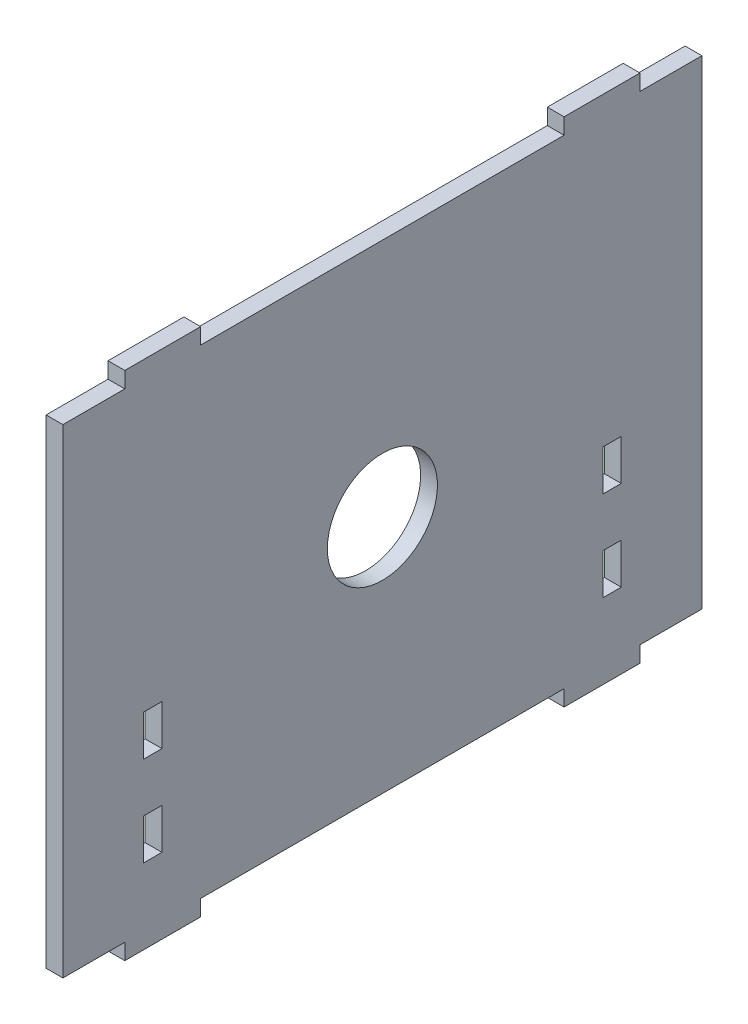
ISO-10303-21;
HEADER;
FILE_DESCRIPTION(('STEP AP214'),'2;1');
FILE_NAME('part.step','',(''),(''),'','','');
FILE_SCHEMA(('AUTOMOTIVE_DESIGN { 1 0 10303 214 1 1 1 1 }'));
ENDSEC;
DATA;
#1=APPLICATION_CONTEXT('core data for automotive mechanical design processes');
#2=APPLICATION_PROTOCOL_DEFINITION('international standard','automotive_design',2000,#1);
#3=PRODUCT_CONTEXT('',#1,'mechanical');
#4=PRODUCT('Part','Part','',(#3));
#5=PRODUCT_RELATED_PRODUCT_CATEGORY('part','',(#4));
#6=PRODUCT_DEFINITION_FORMATION('','',#4);
#7=PRODUCT_DEFINITION_CONTEXT('part definition',#1,'design');
#8=PRODUCT_DEFINITION('design','',#6,#7);
#9=PRODUCT_DEFINITION_SHAPE('','',#8);
#10=(LENGTH_UNIT() NAMED_UNIT(*) SI_UNIT(.MILLI.,.METRE.));
#11=(NAMED_UNIT(*) PLANE_ANGLE_UNIT() SI_UNIT($,.RADIAN.));
#12=(NAMED_UNIT(*) SI_UNIT($,.STERADIAN.) SOLID_ANGLE_UNIT());
#13=UNCERTAINTY_MEASURE_WITH_UNIT(LENGTH_MEASURE(1.E-05),#10,'distance_accuracy_value','');
#14=(GEOMETRIC_REPRESENTATION_CONTEXT(3) GLOBAL_UNCERTAINTY_ASSIGNED_CONTEXT((#13)) GLOBAL_UNIT_ASSIGNED_CONTEXT((#10,
#11,#12)) REPRESENTATION_CONTEXT('',''));
#15=CARTESIAN_POINT('',(0.,0.,0.));
#16=DIRECTION('',(0.,0.,1.));
#17=DIRECTION('',(1.,0.,0.));
#18=AXIS2_PLACEMENT_3D('',#15,#16,#17);
#19=CARTESIAN_POINT('',(5.334,152.4,101.6));
#20=DIRECTION('',(0.,-1.,0.));
#21=DIRECTION('',(0.,0.,-1.));
#22=AXIS2_PLACEMENT_3D('',#19,#20,#21);
#23=PLANE('',#22);
#24=DIRECTION('',(-1.,0.,0.));
#25=VECTOR('',#24,1.);
#26=CARTESIAN_POINT('',(5.334,152.4,57.785));
#27=LINE('',#26,#25);
#28=CARTESIAN_POINT('',(5.334,152.4,57.785));
#29=VERTEX_POINT('',#28);
#30=CARTESIAN_POINT('',(0.,152.4,57.785));
#31=VERTEX_POINT('',#30);
#32=EDGE_CURVE('E286',#29,#31,#27,.T.);
#33=ORIENTED_EDGE('',*,*,#32,.F.);
#34=DIRECTION('',(0.,0.,1.));
#35=VECTOR('',#34,1.);
#36=CARTESIAN_POINT('',(5.334,152.4,101.6));
#37=LINE('',#36,#35);
#38=CARTESIAN_POINT('',(5.334,152.4,-57.785));
#39=VERTEX_POINT('',#38);
#40=EDGE_CURVE('E537',#39,#29,#37,.T.);
#41=ORIENTED_EDGE('',*,*,#40,.F.);
#42=DIRECTION('',(-1.,0.,0.));
#43=VECTOR('',#42,1.);
#44=CARTESIAN_POINT('',(5.334,152.4,-57.785));
#45=LINE('',#44,#43);
#46=CARTESIAN_POINT('',(0.,152.4,-57.785));
#47=VERTEX_POINT('',#46);
#48=EDGE_CURVE('E329',#39,#47,#45,.T.);
#49=ORIENTED_EDGE('',*,*,#48,.T.);
#50=DIRECTION('',(0.,0.,1.));
#51=VECTOR('',#50,1.);
#52=CARTESIAN_POINT('',(0.,152.4,101.6));
#53=LINE('',#52,#51);
#54=EDGE_CURVE('E53',#47,#31,#53,.T.);
#55=ORIENTED_EDGE('',*,*,#54,.T.);
#56=EDGE_LOOP('',(#33,#41,#49,#55));
#57=FACE_BOUND('',#56,.T.);
#58=ADVANCED_FACE('F38',(#57),#23,.F.);
#59=DIRECTION('',(-1.,0.,0.));
#60=VECTOR('',#59,1.);
#61=CARTESIAN_POINT('',(5.334,152.4,-81.915));
#62=LINE('',#61,#60);
#63=CARTESIAN_POINT('',(5.334,152.4,-81.915));
#64=VERTEX_POINT('',#63);
#65=CARTESIAN_POINT('',(0.,152.4,-81.915));
#66=VERTEX_POINT('',#65);
#67=EDGE_CURVE('E332',#64,#66,#62,.T.);
#68=ORIENTED_EDGE('',*,*,#67,.F.);
#69=CARTESIAN_POINT('',(5.334,152.4,-101.6));
#70=VERTEX_POINT('',#69);
#71=EDGE_CURVE('E533',#70,#64,#37,.T.);
#72=ORIENTED_EDGE('',*,*,#71,.F.);
#73=DIRECTION('',(-1.,0.,0.));
#74=VECTOR('',#73,1.);
#75=CARTESIAN_POINT('',(5.334,152.4,-101.6));
#76=LINE('',#75,#74);
#77=CARTESIAN_POINT('',(0.,152.4,-101.6));
#78=VERTEX_POINT('',#77);
#79=EDGE_CURVE('E552',#70,#78,#76,.T.);
#80=ORIENTED_EDGE('',*,*,#79,.T.);
#81=EDGE_CURVE('E526',#78,#66,#53,.T.);
#82=ORIENTED_EDGE('',*,*,#81,.T.);
#83=EDGE_LOOP('',(#68,#72,#80,#82));
#84=FACE_BOUND('',#83,.T.);
#85=ADVANCED_FACE('F570',(#84),#23,.F.);
#86=CARTESIAN_POINT('',(5.334,0.,0.));
#87=DIRECTION('',(-1.,0.,0.));
#88=DIRECTION('',(0.,0.,1.));
#89=AXIS2_PLACEMENT_3D('',#86,#87,#88);
#90=PLANE('',#89);
#91=DIRECTION('',(0.,1.,0.));
#92=VECTOR('',#91,1.);
#93=CARTESIAN_POINT('',(5.334,31.8135,-75.946));
#94=LINE('',#93,#92);
#95=CARTESIAN_POINT('',(5.334,18.8595,-75.946));
#96=VERTEX_POINT('',#95);
#97=CARTESIAN_POINT('',(5.334,31.8135,-75.946));
#98=VERTEX_POINT('',#97);
#99=EDGE_CURVE('E370',#96,#98,#94,.T.);
#100=ORIENTED_EDGE('',*,*,#99,.F.);
#101=DIRECTION('',(0.,0.,-1.));
#102=VECTOR('',#101,1.);
#103=CARTESIAN_POINT('',(5.334,18.8595,-70.104));
#104=LINE('',#103,#102);
#105=CARTESIAN_POINT('',(5.334,18.8595,-70.104));
#106=VERTEX_POINT('',#105);
#107=EDGE_CURVE('E372',#106,#96,#104,.T.);
#108=ORIENTED_EDGE('',*,*,#107,.F.);
#109=DIRECTION('',(0.,-1.,0.));
#110=VECTOR('',#109,1.);
#111=CARTESIAN_POINT('',(5.334,31.8135,-70.104));
#112=LINE('',#111,#110);
#113=CARTESIAN_POINT('',(5.334,31.8135,-70.104));
#114=VERTEX_POINT('',#113);
#115=EDGE_CURVE('E375',#114,#106,#112,.T.);
#116=ORIENTED_EDGE('',*,*,#115,.F.);
#117=DIRECTION('',(0.,0.,1.));
#118=VECTOR('',#117,1.);
#119=CARTESIAN_POINT('',(5.334,31.8135,-70.104));
#120=LINE('',#119,#118);
#121=EDGE_CURVE('E378',#98,#114,#120,.T.);
#122=ORIENTED_EDGE('',*,*,#121,.F.);
#123=EDGE_LOOP('',(#100,#108,#116,#122));
#124=FACE_BOUND('',#123,.T.);
#125=DIRECTION('',(0.,0.,1.));
#126=VECTOR('',#125,1.);
#127=CARTESIAN_POINT('',(5.334,47.4345,70.104));
#128=LINE('',#127,#126);
#129=CARTESIAN_POINT('',(5.334,47.4345,70.104));
#130=VERTEX_POINT('',#129);
#131=CARTESIAN_POINT('',(5.334,47.4345,75.946));
#132=VERTEX_POINT('',#131);
#133=EDGE_CURVE('E409',#130,#132,#128,.T.);
#134=ORIENTED_EDGE('',*,*,#133,.T.);
#135=DIRECTION('',(0.,1.,0.));
#136=VECTOR('',#135,1.);
#137=CARTESIAN_POINT('',(5.334,60.3885,75.946));
#138=LINE('',#137,#136);
#139=CARTESIAN_POINT('',(5.334,60.3885,75.946));
#140=VERTEX_POINT('',#139);
#141=EDGE_CURVE('E399',#132,#140,#138,.T.);
#142=ORIENTED_EDGE('',*,*,#141,.T.);
#143=DIRECTION('',(0.,0.,-1.));
#144=VECTOR('',#143,1.);
#145=CARTESIAN_POINT('',(5.334,60.3885,70.104));
#146=LINE('',#145,#144);
#147=CARTESIAN_POINT('',(5.334,60.3885,70.104));
#148=VERTEX_POINT('',#147);
#149=EDGE_CURVE('E402',#140,#148,#146,.T.);
#150=ORIENTED_EDGE('',*,*,#149,.T.);
#151=DIRECTION('',(0.,-1.,0.));
#152=VECTOR('',#151,1.);
#153=CARTESIAN_POINT('',(5.334,60.3885,70.104));
#154=LINE('',#153,#152);
#155=EDGE_CURVE('E406',#148,#130,#154,.T.);
#156=ORIENTED_EDGE('',*,*,#155,.T.);
#157=EDGE_LOOP('',(#134,#142,#150,#156));
#158=FACE_BOUND('',#157,.T.);
#159=DIRECTION('',(0.,0.,1.));
#160=VECTOR('',#159,1.);
#161=CARTESIAN_POINT('',(5.334,18.8595,70.104));
#162=LINE('',#161,#160);
#163=CARTESIAN_POINT('',(5.334,18.8595,70.104));
#164=VERTEX_POINT('',#163);
#165=CARTESIAN_POINT('',(5.334,18.8595,75.946));
#166=VERTEX_POINT('',#165);
#167=EDGE_CURVE('E443',#164,#166,#162,.T.);
#168=ORIENTED_EDGE('',*,*,#167,.T.);
#169=DIRECTION('',(0.,1.,0.));
#170=VECTOR('',#169,1.);
#171=CARTESIAN_POINT('',(5.334,31.8135,75.946));
#172=LINE('',#171,#170);
#173=CARTESIAN_POINT('',(5.334,31.8135,75.946));
#174=VERTEX_POINT('',#173);
#175=EDGE_CURVE('E433',#166,#174,#172,.T.);
#176=ORIENTED_EDGE('',*,*,#175,.T.);
#177=DIRECTION('',(0.,0.,-1.));
#178=VECTOR('',#177,1.);
#179=CARTESIAN_POINT('',(5.334,31.8135,70.104));
#180=LINE('',#179,#178);
#181=CARTESIAN_POINT('',(5.334,31.8135,70.104));
#182=VERTEX_POINT('',#181);
#183=EDGE_CURVE('E436',#174,#182,#180,.T.);
#184=ORIENTED_EDGE('',*,*,#183,.T.);
#185=DIRECTION('',(0.,-1.,0.));
#186=VECTOR('',#185,1.);
#187=CARTESIAN_POINT('',(5.334,31.8135,70.104));
#188=LINE('',#187,#186);
#189=EDGE_CURVE('E440',#182,#164,#188,.T.);
#190=ORIENTED_EDGE('',*,*,#189,.T.);
#191=EDGE_LOOP('',(#168,#176,#184,#190));
#192=FACE_BOUND('',#191,.T.);
#193=CARTESIAN_POINT('',(5.334,76.2,0.));
#194=DIRECTION('',(-1.,0.,0.));
#195=DIRECTION('',(0.,0.,1.));
#196=AXIS2_PLACEMENT_3D('',#193,#194,#195);
#197=CIRCLE('',#196,17.5);
#198=CARTESIAN_POINT('',(5.334,76.2,17.5));
#199=VERTEX_POINT('',#198);
#200=EDGE_CURVE('E517',#199,#199,#197,.T.);
#201=ORIENTED_EDGE('',*,*,#200,.T.);
#202=EDGE_LOOP('',(#201));
#203=FACE_BOUND('',#202,.T.);
#204=DIRECTION('',(0.,-1.,0.));
#205=VECTOR('',#204,1.);
#206=CARTESIAN_POINT('',(5.334,0.,101.6));
#207=LINE('',#206,#205);
#208=CARTESIAN_POINT('',(5.334,152.4,101.6));
#209=VERTEX_POINT('',#208);
#210=CARTESIAN_POINT('',(5.334,0.,101.6));
#211=VERTEX_POINT('',#210);
#212=EDGE_CURVE('E523',#209,#211,#207,.T.);
#213=ORIENTED_EDGE('',*,*,#212,.T.);
#214=DIRECTION('',(0.,0.,-1.));
#215=VECTOR('',#214,1.);
#216=CARTESIAN_POINT('',(5.334,0.,101.6));
#217=LINE('',#216,#215);
#218=CARTESIAN_POINT('',(5.334,0.,81.915));
#219=VERTEX_POINT('',#218);
#220=EDGE_CURVE('E527',#211,#219,#217,.T.);
#221=ORIENTED_EDGE('',*,*,#220,.T.);
#222=DIRECTION('',(0.,-1.,0.));
#223=VECTOR('',#222,1.);
#224=CARTESIAN_POINT('',(5.334,0.,81.915));
#225=LINE('',#224,#223);
#226=CARTESIAN_POINT('',(5.334,-5.08,81.915));
#227=VERTEX_POINT('',#226);
#228=EDGE_CURVE('E498',#219,#227,#225,.T.);
#229=ORIENTED_EDGE('',*,*,#228,.T.);
#230=DIRECTION('',(0.,0.,1.));
#231=VECTOR('',#230,1.);
#232=CARTESIAN_POINT('',(5.334,-5.08,57.785));
#233=LINE('',#232,#231);
#234=CARTESIAN_POINT('',(5.334,-5.08,57.785));
#235=VERTEX_POINT('',#234);
#236=EDGE_CURVE('E494',#235,#227,#233,.T.);
#237=ORIENTED_EDGE('',*,*,#236,.F.);
#238=DIRECTION('',(0.,-1.,0.));
#239=VECTOR('',#238,1.);
#240=CARTESIAN_POINT('',(5.334,0.,57.785));
#241=LINE('',#240,#239);
#242=CARTESIAN_POINT('',(5.334,0.,57.785));
#243=VERTEX_POINT('',#242);
#244=EDGE_CURVE('E491',#243,#235,#241,.T.);
#245=ORIENTED_EDGE('',*,*,#244,.F.);
#246=CARTESIAN_POINT('',(5.334,0.,-57.785));
#247=VERTEX_POINT('',#246);
#248=EDGE_CURVE('E531',#243,#247,#217,.T.);
#249=ORIENTED_EDGE('',*,*,#248,.T.);
#250=DIRECTION('',(0.,-1.,0.));
#251=VECTOR('',#250,1.);
#252=CARTESIAN_POINT('',(5.334,0.,-57.785));
#253=LINE('',#252,#251);
#254=CARTESIAN_POINT('',(5.334,-5.08,-57.785));
#255=VERTEX_POINT('',#254);
#256=EDGE_CURVE('E463',#247,#255,#253,.T.);
#257=ORIENTED_EDGE('',*,*,#256,.T.);
#258=DIRECTION('',(0.,0.,-1.));
#259=VECTOR('',#258,1.);
#260=CARTESIAN_POINT('',(5.334,-5.08,-57.785));
#261=LINE('',#260,#259);
#262=CARTESIAN_POINT('',(5.334,-5.08,-81.915));
#263=VERTEX_POINT('',#262);
#264=EDGE_CURVE('E470',#255,#263,#261,.T.);
#265=ORIENTED_EDGE('',*,*,#264,.T.);
#266=DIRECTION('',(0.,-1.,0.));
#267=VECTOR('',#266,1.);
#268=CARTESIAN_POINT('',(5.334,0.,-81.915));
#269=LINE('',#268,#267);
#270=CARTESIAN_POINT('',(5.334,0.,-81.915));
#271=VERTEX_POINT('',#270);
#272=EDGE_CURVE('E466',#271,#263,#269,.T.);
#273=ORIENTED_EDGE('',*,*,#272,.F.);
#274=CARTESIAN_POINT('',(5.334,0.,-101.6));
#275=VERTEX_POINT('',#274);
#276=EDGE_CURVE('E525',#271,#275,#217,.T.);
#277=ORIENTED_EDGE('',*,*,#276,.T.);
#278=DIRECTION('',(0.,1.,0.));
#279=VECTOR('',#278,1.);
#280=CARTESIAN_POINT('',(5.334,0.,-101.6));
#281=LINE('',#280,#279);
#282=EDGE_CURVE('E530',#275,#70,#281,.T.);
#283=ORIENTED_EDGE('',*,*,#282,.T.);
#284=ORIENTED_EDGE('',*,*,#71,.T.);
#285=DIRECTION('',(0.,1.,0.));
#286=VECTOR('',#285,1.);
#287=CARTESIAN_POINT('',(5.334,152.4,-81.915));
#288=LINE('',#287,#286);
#289=CARTESIAN_POINT('',(5.334,157.48,-81.915));
#290=VERTEX_POINT('',#289);
#291=EDGE_CURVE('E319',#64,#290,#288,.T.);
#292=ORIENTED_EDGE('',*,*,#291,.T.);
#293=DIRECTION('',(0.,0.,-1.));
#294=VECTOR('',#293,1.);
#295=CARTESIAN_POINT('',(5.334,157.48,-57.785));
#296=LINE('',#295,#294);
#297=CARTESIAN_POINT('',(5.334,157.48,-57.785));
#298=VERTEX_POINT('',#297);
#299=EDGE_CURVE('E315',#298,#290,#296,.T.);
#300=ORIENTED_EDGE('',*,*,#299,.F.);
#301=DIRECTION('',(0.,1.,0.));
#302=VECTOR('',#301,1.);
#303=CARTESIAN_POINT('',(5.334,152.4,-57.785));
#304=LINE('',#303,#302);
#305=EDGE_CURVE('E312',#39,#298,#304,.T.);
#306=ORIENTED_EDGE('',*,*,#305,.F.);
#307=ORIENTED_EDGE('',*,*,#40,.T.);
#308=DIRECTION('',(0.,1.,0.));
#309=VECTOR('',#308,1.);
#310=CARTESIAN_POINT('',(5.334,152.4,57.785));
#311=LINE('',#310,#309);
#312=CARTESIAN_POINT('',(5.334,157.48,57.785));
#313=VERTEX_POINT('',#312);
#314=EDGE_CURVE('E282',#29,#313,#311,.T.);
#315=ORIENTED_EDGE('',*,*,#314,.T.);
#316=DIRECTION('',(0.,0.,1.));
#317=VECTOR('',#316,1.);
#318=CARTESIAN_POINT('',(5.334,157.48,57.785));
#319=LINE('',#318,#317);
#320=CARTESIAN_POINT('',(5.334,157.48,81.915));
#321=VERTEX_POINT('',#320);
#322=EDGE_CURVE('E273',#313,#321,#319,.T.);
#323=ORIENTED_EDGE('',*,*,#322,.T.);
#324=DIRECTION('',(0.,1.,0.));
#325=VECTOR('',#324,1.);
#326=CARTESIAN_POINT('',(5.334,152.4,81.915));
#327=LINE('',#326,#325);
#328=CARTESIAN_POINT('',(5.334,152.4,81.915));
#329=VERTEX_POINT('',#328);
#330=EDGE_CURVE('E279',#329,#321,#327,.T.);
#331=ORIENTED_EDGE('',*,*,#330,.F.);
#332=EDGE_CURVE('E61',#329,#209,#37,.T.);
#333=ORIENTED_EDGE('',*,*,#332,.T.);
#334=EDGE_LOOP('',(#213,#221,#229,#237,#245,#249,#257,#265,#273,#277,#283,#284,#292,#300,#306,
#307,#315,#323,#331,#333));
#335=FACE_BOUND('',#334,.T.);
#336=DIRECTION('',(0.,1.,0.));
#337=VECTOR('',#336,1.);
#338=CARTESIAN_POINT('',(5.334,60.3885,-75.946));
#339=LINE('',#338,#337);
#340=CARTESIAN_POINT('',(5.334,47.4345,-75.946));
#341=VERTEX_POINT('',#340);
#342=CARTESIAN_POINT('',(5.334,60.3885,-75.946));
#343=VERTEX_POINT('',#342);
#344=EDGE_CURVE('E337',#341,#343,#339,.T.);
#345=ORIENTED_EDGE('',*,*,#344,.F.);
#346=DIRECTION('',(0.,0.,-1.));
#347=VECTOR('',#346,1.);
#348=CARTESIAN_POINT('',(5.334,47.4345,-70.104));
#349=LINE('',#348,#347);
#350=CARTESIAN_POINT('',(5.334,47.4345,-70.104));
#351=VERTEX_POINT('',#350);
#352=EDGE_CURVE('E339',#351,#341,#349,.T.);
#353=ORIENTED_EDGE('',*,*,#352,.F.);
#354=DIRECTION('',(0.,-1.,0.));
#355=VECTOR('',#354,1.);
#356=CARTESIAN_POINT('',(5.334,60.3885,-70.104));
#357=LINE('',#356,#355);
#358=CARTESIAN_POINT('',(5.334,60.3885,-70.104));
#359=VERTEX_POINT('',#358);
#360=EDGE_CURVE('E342',#359,#351,#357,.T.);
#361=ORIENTED_EDGE('',*,*,#360,.F.);
#362=DIRECTION('',(0.,0.,1.));
#363=VECTOR('',#362,1.);
#364=CARTESIAN_POINT('',(5.334,60.3885,-70.104));
#365=LINE('',#364,#363);
#366=EDGE_CURVE('E345',#343,#359,#365,.T.);
#367=ORIENTED_EDGE('',*,*,#366,.F.);
#368=EDGE_LOOP('',(#345,#353,#361,#367));
#369=FACE_BOUND('',#368,.T.);
#370=ADVANCED_FACE('F276',(#124,#158,#192,#203,#335,#369),#90,.F.);
#371=CARTESIAN_POINT('',(0.,0.,0.));
#372=DIRECTION('',(-1.,0.,0.));
#373=DIRECTION('',(0.,0.,1.));
#374=AXIS2_PLACEMENT_3D('',#371,#372,#373);
#375=PLANE('',#374);
#376=DIRECTION('',(0.,1.,0.));
#377=VECTOR('',#376,1.);
#378=CARTESIAN_POINT('',(0.,60.3885,75.946));
#379=LINE('',#378,#377);
#380=CARTESIAN_POINT('',(0.,47.4345,75.946));
#381=VERTEX_POINT('',#380);
#382=CARTESIAN_POINT('',(0.,60.3885,75.946));
#383=VERTEX_POINT('',#382);
#384=EDGE_CURVE('E413',#381,#383,#379,.T.);
#385=ORIENTED_EDGE('',*,*,#384,.F.);
#386=DIRECTION('',(0.,0.,1.));
#387=VECTOR('',#386,1.);
#388=CARTESIAN_POINT('',(0.,47.4345,70.104));
#389=LINE('',#388,#387);
#390=CARTESIAN_POINT('',(0.,47.4345,70.104));
#391=VERTEX_POINT('',#390);
#392=EDGE_CURVE('E403',#391,#381,#389,.T.);
#393=ORIENTED_EDGE('',*,*,#392,.F.);
#394=DIRECTION('',(0.,-1.,0.));
#395=VECTOR('',#394,1.);
#396=CARTESIAN_POINT('',(0.,60.3885,70.104));
#397=LINE('',#396,#395);
#398=CARTESIAN_POINT('',(0.,60.3885,70.104));
#399=VERTEX_POINT('',#398);
#400=EDGE_CURVE('E419',#399,#391,#397,.T.);
#401=ORIENTED_EDGE('',*,*,#400,.F.);
#402=DIRECTION('',(0.,0.,-1.));
#403=VECTOR('',#402,1.);
#404=CARTESIAN_POINT('',(0.,60.3885,70.104));
#405=LINE('',#404,#403);
#406=EDGE_CURVE('E415',#383,#399,#405,.T.);
#407=ORIENTED_EDGE('',*,*,#406,.F.);
#408=EDGE_LOOP('',(#385,#393,#401,#407));
#409=FACE_BOUND('',#408,.T.);
#410=DIRECTION('',(0.,1.,0.));
#411=VECTOR('',#410,1.);
#412=CARTESIAN_POINT('',(0.,31.8135,75.946));
#413=LINE('',#412,#411);
#414=CARTESIAN_POINT('',(0.,18.8595,75.946));
#415=VERTEX_POINT('',#414);
#416=CARTESIAN_POINT('',(0.,31.8135,75.946));
#417=VERTEX_POINT('',#416);
#418=EDGE_CURVE('E363',#415,#417,#413,.T.);
#419=ORIENTED_EDGE('',*,*,#418,.F.);
#420=DIRECTION('',(0.,0.,1.));
#421=VECTOR('',#420,1.);
#422=CARTESIAN_POINT('',(0.,18.8595,70.104));
#423=LINE('',#422,#421);
#424=CARTESIAN_POINT('',(0.,18.8595,70.104));
#425=VERTEX_POINT('',#424);
#426=EDGE_CURVE('E437',#425,#415,#423,.T.);
#427=ORIENTED_EDGE('',*,*,#426,.F.);
#428=DIRECTION('',(0.,-1.,0.));
#429=VECTOR('',#428,1.);
#430=CARTESIAN_POINT('',(0.,31.8135,70.104));
#431=LINE('',#430,#429);
#432=CARTESIAN_POINT('',(0.,31.8135,70.104));
#433=VERTEX_POINT('',#432);
#434=EDGE_CURVE('E451',#433,#425,#431,.T.);
#435=ORIENTED_EDGE('',*,*,#434,.F.);
#436=DIRECTION('',(0.,0.,-1.));
#437=VECTOR('',#436,1.);
#438=CARTESIAN_POINT('',(0.,31.8135,70.104));
#439=LINE('',#438,#437);
#440=EDGE_CURVE('E448',#417,#433,#439,.T.);
#441=ORIENTED_EDGE('',*,*,#440,.F.);
#442=EDGE_LOOP('',(#419,#427,#435,#441));
#443=FACE_BOUND('',#442,.T.);
#444=CARTESIAN_POINT('',(0.,76.2,0.));
#445=DIRECTION('',(-1.,0.,0.));
#446=DIRECTION('',(0.,0.,1.));
#447=AXIS2_PLACEMENT_3D('',#444,#445,#446);
#448=CIRCLE('',#447,17.5);
#449=CARTESIAN_POINT('',(0.,76.2,17.5));
#450=VERTEX_POINT('',#449);
#451=EDGE_CURVE('E511',#450,#450,#448,.T.);
#452=ORIENTED_EDGE('',*,*,#451,.F.);
#453=EDGE_LOOP('',(#452));
#454=FACE_BOUND('',#453,.T.);
#455=DIRECTION('',(0.,-1.,0.));
#456=VECTOR('',#455,1.);
#457=CARTESIAN_POINT('',(0.,0.,101.6));
#458=LINE('',#457,#456);
#459=CARTESIAN_POINT('',(0.,152.4,101.6));
#460=VERTEX_POINT('',#459);
#461=CARTESIAN_POINT('',(0.,0.,101.6));
#462=VERTEX_POINT('',#461);
#463=EDGE_CURVE('E520',#460,#462,#458,.T.);
#464=ORIENTED_EDGE('',*,*,#463,.F.);
#465=CARTESIAN_POINT('',(0.,152.4,81.915));
#466=VERTEX_POINT('',#465);
#467=EDGE_CURVE('E547',#466,#460,#53,.T.);
#468=ORIENTED_EDGE('',*,*,#467,.F.);
#469=DIRECTION('',(0.,1.,0.));
#470=VECTOR('',#469,1.);
#471=CARTESIAN_POINT('',(0.,152.4,81.915));
#472=LINE('',#471,#470);
#473=CARTESIAN_POINT('',(0.,157.48,81.915));
#474=VERTEX_POINT('',#473);
#475=EDGE_CURVE('E305',#466,#474,#472,.T.);
#476=ORIENTED_EDGE('',*,*,#475,.T.);
#477=DIRECTION('',(0.,0.,1.));
#478=VECTOR('',#477,1.);
#479=CARTESIAN_POINT('',(0.,157.48,57.785));
#480=LINE('',#479,#478);
#481=CARTESIAN_POINT('',(0.,157.48,57.785));
#482=VERTEX_POINT('',#481);
#483=EDGE_CURVE('E291',#482,#474,#480,.T.);
#484=ORIENTED_EDGE('',*,*,#483,.F.);
#485=DIRECTION('',(0.,1.,0.));
#486=VECTOR('',#485,1.);
#487=CARTESIAN_POINT('',(0.,152.4,57.785));
#488=LINE('',#487,#486);
#489=EDGE_CURVE('E302',#31,#482,#488,.T.);
#490=ORIENTED_EDGE('',*,*,#489,.F.);
#491=ORIENTED_EDGE('',*,*,#54,.F.);
#492=DIRECTION('',(0.,1.,0.));
#493=VECTOR('',#492,1.);
#494=CARTESIAN_POINT('',(0.,152.4,-57.785));
#495=LINE('',#494,#493);
#496=CARTESIAN_POINT('',(0.,157.48,-57.785));
#497=VERTEX_POINT('',#496);
#498=EDGE_CURVE('E308',#47,#497,#495,.T.);
#499=ORIENTED_EDGE('',*,*,#498,.T.);
#500=DIRECTION('',(0.,0.,-1.));
#501=VECTOR('',#500,1.);
#502=CARTESIAN_POINT('',(0.,157.48,-57.785));
#503=LINE('',#502,#501);
#504=CARTESIAN_POINT('',(0.,157.48,-81.915));
#505=VERTEX_POINT('',#504);
#506=EDGE_CURVE('E324',#497,#505,#503,.T.);
#507=ORIENTED_EDGE('',*,*,#506,.T.);
#508=DIRECTION('',(0.,1.,0.));
#509=VECTOR('',#508,1.);
#510=CARTESIAN_POINT('',(0.,152.4,-81.915));
#511=LINE('',#510,#509);
#512=EDGE_CURVE('E316',#66,#505,#511,.T.);
#513=ORIENTED_EDGE('',*,*,#512,.F.);
#514=ORIENTED_EDGE('',*,*,#81,.F.);
#515=DIRECTION('',(0.,1.,0.));
#516=VECTOR('',#515,1.);
#517=CARTESIAN_POINT('',(0.,0.,-101.6));
#518=LINE('',#517,#516);
#519=CARTESIAN_POINT('',(0.,0.,-101.6));
#520=VERTEX_POINT('',#519);
#521=EDGE_CURVE('E544',#520,#78,#518,.T.);
#522=ORIENTED_EDGE('',*,*,#521,.F.);
#523=DIRECTION('',(0.,0.,-1.));
#524=VECTOR('',#523,1.);
#525=CARTESIAN_POINT('',(0.,0.,101.6));
#526=LINE('',#525,#524);
#527=CARTESIAN_POINT('',(0.,0.,-81.915));
#528=VERTEX_POINT('',#527);
#529=EDGE_CURVE('E540',#528,#520,#526,.T.);
#530=ORIENTED_EDGE('',*,*,#529,.F.);
#531=DIRECTION('',(0.,-1.,0.));
#532=VECTOR('',#531,1.);
#533=CARTESIAN_POINT('',(0.,0.,-81.915));
#534=LINE('',#533,#532);
#535=CARTESIAN_POINT('',(0.,-5.08,-81.915));
#536=VERTEX_POINT('',#535);
#537=EDGE_CURVE('E475',#528,#536,#534,.T.);
#538=ORIENTED_EDGE('',*,*,#537,.T.);
#539=DIRECTION('',(0.,0.,-1.));
#540=VECTOR('',#539,1.);
#541=CARTESIAN_POINT('',(0.,-5.08,-57.785));
#542=LINE('',#541,#540);
#543=CARTESIAN_POINT('',(0.,-5.08,-57.785));
#544=VERTEX_POINT('',#543);
#545=EDGE_CURVE('E467',#544,#536,#542,.T.);
#546=ORIENTED_EDGE('',*,*,#545,.F.);
#547=DIRECTION('',(0.,-1.,0.));
#548=VECTOR('',#547,1.);
#549=CARTESIAN_POINT('',(0.,0.,-57.785));
#550=LINE('',#549,#548);
#551=CARTESIAN_POINT('',(0.,0.,-57.785));
#552=VERTEX_POINT('',#551);
#553=EDGE_CURVE('E426',#552,#544,#550,.T.);
#554=ORIENTED_EDGE('',*,*,#553,.F.);
#555=CARTESIAN_POINT('',(0.,0.,57.785));
#556=VERTEX_POINT('',#555);
#557=EDGE_CURVE('E545',#556,#552,#526,.T.);
#558=ORIENTED_EDGE('',*,*,#557,.F.);
#559=DIRECTION('',(0.,-1.,0.));
#560=VECTOR('',#559,1.);
#561=CARTESIAN_POINT('',(0.,0.,57.785));
#562=LINE('',#561,#560);
#563=CARTESIAN_POINT('',(0.,-5.08,57.785));
#564=VERTEX_POINT('',#563);
#565=EDGE_CURVE('E483',#556,#564,#562,.T.);
#566=ORIENTED_EDGE('',*,*,#565,.T.);
#567=DIRECTION('',(0.,0.,1.));
#568=VECTOR('',#567,1.);
#569=CARTESIAN_POINT('',(0.,-5.08,57.785));
#570=LINE('',#569,#568);
#571=CARTESIAN_POINT('',(0.,-5.08,81.915));
#572=VERTEX_POINT('',#571);
#573=EDGE_CURVE('E503',#564,#572,#570,.T.);
#574=ORIENTED_EDGE('',*,*,#573,.T.);
#575=DIRECTION('',(0.,-1.,0.));
#576=VECTOR('',#575,1.);
#577=CARTESIAN_POINT('',(0.,0.,81.915));
#578=LINE('',#577,#576);
#579=CARTESIAN_POINT('',(0.,0.,81.915));
#580=VERTEX_POINT('',#579);
#581=EDGE_CURVE('E495',#580,#572,#578,.T.);
#582=ORIENTED_EDGE('',*,*,#581,.F.);
#583=EDGE_CURVE('E541',#462,#580,#526,.T.);
#584=ORIENTED_EDGE('',*,*,#583,.F.);
#585=EDGE_LOOP('',(#464,#468,#476,#484,#490,#491,#499,#507,#513,#514,#522,#530,#538,#546,#554,
#558,#566,#574,#582,#584));
#586=FACE_BOUND('',#585,.T.);
#587=DIRECTION('',(0.,0.,-1.));
#588=VECTOR('',#587,1.);
#589=CARTESIAN_POINT('',(0.,18.8595,-70.104));
#590=LINE('',#589,#588);
#591=CARTESIAN_POINT('',(0.,18.8595,-70.104));
#592=VERTEX_POINT('',#591);
#593=CARTESIAN_POINT('',(0.,18.8595,-75.946));
#594=VERTEX_POINT('',#593);
#595=EDGE_CURVE('E383',#592,#594,#590,.T.);
#596=ORIENTED_EDGE('',*,*,#595,.T.);
#597=DIRECTION('',(0.,1.,0.));
#598=VECTOR('',#597,1.);
#599=CARTESIAN_POINT('',(0.,31.8135,-75.946));
#600=LINE('',#599,#598);
#601=CARTESIAN_POINT('',(0.,31.8135,-75.946));
#602=VERTEX_POINT('',#601);
#603=EDGE_CURVE('E331',#594,#602,#600,.T.);
#604=ORIENTED_EDGE('',*,*,#603,.T.);
#605=DIRECTION('',(0.,0.,1.));
#606=VECTOR('',#605,1.);
#607=CARTESIAN_POINT('',(0.,31.8135,-70.104));
#608=LINE('',#607,#606);
#609=CARTESIAN_POINT('',(0.,31.8135,-70.104));
#610=VERTEX_POINT('',#609);
#611=EDGE_CURVE('E373',#602,#610,#608,.T.);
#612=ORIENTED_EDGE('',*,*,#611,.T.);
#613=DIRECTION('',(0.,-1.,0.));
#614=VECTOR('',#613,1.);
#615=CARTESIAN_POINT('',(0.,31.8135,-70.104));
#616=LINE('',#615,#614);
#617=EDGE_CURVE('E386',#610,#592,#616,.T.);
#618=ORIENTED_EDGE('',*,*,#617,.T.);
#619=EDGE_LOOP('',(#596,#604,#612,#618));
#620=FACE_BOUND('',#619,.T.);
#621=DIRECTION('',(0.,0.,-1.));
#622=VECTOR('',#621,1.);
#623=CARTESIAN_POINT('',(0.,47.4345,-70.104));
#624=LINE('',#623,#622);
#625=CARTESIAN_POINT('',(0.,47.4345,-70.104));
#626=VERTEX_POINT('',#625);
#627=CARTESIAN_POINT('',(0.,47.4345,-75.946));
#628=VERTEX_POINT('',#627);
#629=EDGE_CURVE('E351',#626,#628,#624,.T.);
#630=ORIENTED_EDGE('',*,*,#629,.T.);
#631=DIRECTION('',(0.,1.,0.));
#632=VECTOR('',#631,1.);
#633=CARTESIAN_POINT('',(0.,60.3885,-75.946));
#634=LINE('',#633,#632);
#635=CARTESIAN_POINT('',(0.,60.3885,-75.946));
#636=VERTEX_POINT('',#635);
#637=EDGE_CURVE('E348',#628,#636,#634,.T.);
#638=ORIENTED_EDGE('',*,*,#637,.T.);
#639=DIRECTION('',(0.,0.,1.));
#640=VECTOR('',#639,1.);
#641=CARTESIAN_POINT('',(0.,60.3885,-70.104));
#642=LINE('',#641,#640);
#643=CARTESIAN_POINT('',(0.,60.3885,-70.104));
#644=VERTEX_POINT('',#643);
#645=EDGE_CURVE('E340',#636,#644,#642,.T.);
#646=ORIENTED_EDGE('',*,*,#645,.T.);
#647=DIRECTION('',(0.,-1.,0.));
#648=VECTOR('',#647,1.);
#649=CARTESIAN_POINT('',(0.,60.3885,-70.104));
#650=LINE('',#649,#648);
#651=EDGE_CURVE('E355',#644,#626,#650,.T.);
#652=ORIENTED_EDGE('',*,*,#651,.T.);
#653=EDGE_LOOP('',(#630,#638,#646,#652));
#654=FACE_BOUND('',#653,.T.);
#655=ADVANCED_FACE('F565',(#409,#443,#454,#586,#620,#654),#375,.T.);
#656=CARTESIAN_POINT('',(5.334,0.,101.6));
#657=DIRECTION('',(0.,1.,0.));
#658=DIRECTION('',(0.,0.,1.));
#659=AXIS2_PLACEMENT_3D('',#656,#657,#658);
#660=PLANE('',#659);
#661=DIRECTION('',(-1.,0.,0.));
#662=VECTOR('',#661,1.);
#663=CARTESIAN_POINT('',(5.334,0.,-57.785));
#664=LINE('',#663,#662);
#665=EDGE_CURVE('E472',#247,#552,#664,.T.);
#666=ORIENTED_EDGE('',*,*,#665,.F.);
#667=ORIENTED_EDGE('',*,*,#248,.F.);
#668=DIRECTION('',(-1.,0.,0.));
#669=VECTOR('',#668,1.);
#670=CARTESIAN_POINT('',(5.334,0.,57.785));
#671=LINE('',#670,#669);
#672=EDGE_CURVE('E508',#243,#556,#671,.T.);
#673=ORIENTED_EDGE('',*,*,#672,.T.);
#674=ORIENTED_EDGE('',*,*,#557,.T.);
#675=EDGE_LOOP('',(#666,#667,#673,#674));
#676=FACE_BOUND('',#675,.T.);
#677=ADVANCED_FACE('F594',(#676),#660,.F.);
#678=DIRECTION('',(-1.,0.,0.));
#679=VECTOR('',#678,1.);
#680=CARTESIAN_POINT('',(5.334,0.,81.915));
#681=LINE('',#680,#679);
#682=EDGE_CURVE('E512',#219,#580,#681,.T.);
#683=ORIENTED_EDGE('',*,*,#682,.F.);
#684=ORIENTED_EDGE('',*,*,#220,.F.);
#685=DIRECTION('',(-1.,0.,0.));
#686=VECTOR('',#685,1.);
#687=CARTESIAN_POINT('',(5.334,0.,101.6));
#688=LINE('',#687,#686);
#689=EDGE_CURVE('E11',#211,#462,#688,.T.);
#690=ORIENTED_EDGE('',*,*,#689,.T.);
#691=ORIENTED_EDGE('',*,*,#583,.T.);
#692=EDGE_LOOP('',(#683,#684,#690,#691));
#693=FACE_BOUND('',#692,.T.);
#694=ADVANCED_FACE('F606',(#693),#660,.F.);
#695=CARTESIAN_POINT('',(5.334,0.,101.6));
#696=DIRECTION('',(0.,0.,-1.));
#697=DIRECTION('',(-1.,0.,0.));
#698=AXIS2_PLACEMENT_3D('',#695,#696,#697);
#699=PLANE('',#698);
#700=ORIENTED_EDGE('',*,*,#463,.T.);
#701=ORIENTED_EDGE('',*,*,#689,.F.);
#702=ORIENTED_EDGE('',*,*,#212,.F.);
#703=DIRECTION('',(-1.,0.,0.));
#704=VECTOR('',#703,1.);
#705=CARTESIAN_POINT('',(5.334,152.4,101.6));
#706=LINE('',#705,#704);
#707=EDGE_CURVE('E536',#209,#460,#706,.T.);
#708=ORIENTED_EDGE('',*,*,#707,.T.);
#709=EDGE_LOOP('',(#700,#701,#702,#708));
#710=FACE_BOUND('',#709,.T.);
#711=ADVANCED_FACE('F40',(#710),#699,.F.);
#712=ORIENTED_EDGE('',*,*,#276,.F.);
#713=DIRECTION('',(-1.,0.,0.));
#714=VECTOR('',#713,1.);
#715=CARTESIAN_POINT('',(5.334,0.,-81.915));
#716=LINE('',#715,#714);
#717=EDGE_CURVE('E486',#271,#528,#716,.T.);
#718=ORIENTED_EDGE('',*,*,#717,.T.);
#719=ORIENTED_EDGE('',*,*,#529,.T.);
#720=DIRECTION('',(-1.,0.,0.));
#721=VECTOR('',#720,1.);
#722=CARTESIAN_POINT('',(5.334,0.,-101.6));
#723=LINE('',#722,#721);
#724=EDGE_CURVE('E46',#275,#520,#723,.T.);
#725=ORIENTED_EDGE('',*,*,#724,.F.);
#726=EDGE_LOOP('',(#712,#718,#719,#725));
#727=FACE_BOUND('',#726,.T.);
#728=ADVANCED_FACE('F592',(#727),#660,.F.);
#729=CARTESIAN_POINT('',(5.334,0.,-101.6));
#730=DIRECTION('',(0.,0.,1.));
#731=DIRECTION('',(1.,0.,0.));
#732=AXIS2_PLACEMENT_3D('',#729,#730,#731);
#733=PLANE('',#732);
#734=ORIENTED_EDGE('',*,*,#521,.T.);
#735=ORIENTED_EDGE('',*,*,#79,.F.);
#736=ORIENTED_EDGE('',*,*,#282,.F.);
#737=ORIENTED_EDGE('',*,*,#724,.T.);
#738=EDGE_LOOP('',(#734,#735,#736,#737));
#739=FACE_BOUND('',#738,.T.);
#740=ADVANCED_FACE('F559',(#739),#733,.F.);
#741=ORIENTED_EDGE('',*,*,#332,.F.);
#742=DIRECTION('',(-1.,0.,0.));
#743=VECTOR('',#742,1.);
#744=CARTESIAN_POINT('',(5.334,152.4,81.915));
#745=LINE('',#744,#743);
#746=EDGE_CURVE('E296',#329,#466,#745,.T.);
#747=ORIENTED_EDGE('',*,*,#746,.T.);
#748=ORIENTED_EDGE('',*,*,#467,.T.);
#749=ORIENTED_EDGE('',*,*,#707,.F.);
#750=EDGE_LOOP('',(#741,#747,#748,#749));
#751=FACE_BOUND('',#750,.T.);
#752=ADVANCED_FACE('F610',(#751),#23,.F.);
#753=CARTESIAN_POINT('',(5.334,76.2,0.));
#754=DIRECTION('',(-1.,0.,0.));
#755=DIRECTION('',(0.,0.,1.));
#756=AXIS2_PLACEMENT_3D('',#753,#754,#755);
#757=CYLINDRICAL_SURFACE('',#756,17.5);
#758=ORIENTED_EDGE('',*,*,#200,.F.);
#759=EDGE_LOOP('',(#758));
#760=FACE_BOUND('',#759,.T.);
#761=ORIENTED_EDGE('',*,*,#451,.T.);
#762=EDGE_LOOP('',(#761));
#763=FACE_BOUND('',#762,.T.);
#764=ADVANCED_FACE('F612',(#760,#763),#757,.F.);
#765=CARTESIAN_POINT('',(5.334,0.,57.785));
#766=DIRECTION('',(0.,0.,-1.));
#767=DIRECTION('',(0.,1.,0.));
#768=AXIS2_PLACEMENT_3D('',#765,#766,#767);
#769=PLANE('',#768);
#770=ORIENTED_EDGE('',*,*,#565,.F.);
#771=ORIENTED_EDGE('',*,*,#672,.F.);
#772=ORIENTED_EDGE('',*,*,#244,.T.);
#773=DIRECTION('',(-1.,0.,0.));
#774=VECTOR('',#773,1.);
#775=CARTESIAN_POINT('',(5.334,-5.08,57.785));
#776=LINE('',#775,#774);
#777=EDGE_CURVE('E500',#235,#564,#776,.T.);
#778=ORIENTED_EDGE('',*,*,#777,.T.);
#779=EDGE_LOOP('',(#770,#771,#772,#778));
#780=FACE_BOUND('',#779,.T.);
#781=ADVANCED_FACE('F598',(#780),#769,.T.);
#782=CARTESIAN_POINT('',(5.334,0.,81.915));
#783=DIRECTION('',(0.,0.,-1.));
#784=DIRECTION('',(-1.,0.,0.));
#785=AXIS2_PLACEMENT_3D('',#782,#783,#784);
#786=PLANE('',#785);
#787=ORIENTED_EDGE('',*,*,#581,.T.);
#788=DIRECTION('',(-1.,0.,0.));
#789=VECTOR('',#788,1.);
#790=CARTESIAN_POINT('',(5.334,-5.08,81.915));
#791=LINE('',#790,#789);
#792=EDGE_CURVE('E514',#227,#572,#791,.T.);
#793=ORIENTED_EDGE('',*,*,#792,.F.);
#794=ORIENTED_EDGE('',*,*,#228,.F.);
#795=ORIENTED_EDGE('',*,*,#682,.T.);
#796=EDGE_LOOP('',(#787,#793,#794,#795));
#797=FACE_BOUND('',#796,.T.);
#798=ADVANCED_FACE('F603',(#797),#786,.F.);
#799=CARTESIAN_POINT('',(5.334,-5.08,57.785));
#800=DIRECTION('',(0.,-1.,0.));
#801=DIRECTION('',(0.,0.,-1.));
#802=AXIS2_PLACEMENT_3D('',#799,#800,#801);
#803=PLANE('',#802);
#804=ORIENTED_EDGE('',*,*,#573,.F.);
#805=ORIENTED_EDGE('',*,*,#777,.F.);
#806=ORIENTED_EDGE('',*,*,#236,.T.);
#807=ORIENTED_EDGE('',*,*,#792,.T.);
#808=EDGE_LOOP('',(#804,#805,#806,#807));
#809=FACE_BOUND('',#808,.T.);
#810=ADVANCED_FACE('F600',(#809),#803,.T.);
#811=CARTESIAN_POINT('',(5.334,0.,-57.785));
#812=DIRECTION('',(0.,0.,-1.));
#813=DIRECTION('',(0.,1.,0.));
#814=AXIS2_PLACEMENT_3D('',#811,#812,#813);
#815=PLANE('',#814);
#816=ORIENTED_EDGE('',*,*,#553,.T.);
#817=DIRECTION('',(-1.,0.,0.));
#818=VECTOR('',#817,1.);
#819=CARTESIAN_POINT('',(5.334,-5.08,-57.785));
#820=LINE('',#819,#818);
#821=EDGE_CURVE('E480',#255,#544,#820,.T.);
#822=ORIENTED_EDGE('',*,*,#821,.F.);
#823=ORIENTED_EDGE('',*,*,#256,.F.);
#824=ORIENTED_EDGE('',*,*,#665,.T.);
#825=EDGE_LOOP('',(#816,#822,#823,#824));
#826=FACE_BOUND('',#825,.T.);
#827=ADVANCED_FACE('F584',(#826),#815,.F.);
#828=CARTESIAN_POINT('',(5.334,-5.08,-57.785));
#829=DIRECTION('',(0.,1.,0.));
#830=DIRECTION('',(0.,0.,1.));
#831=AXIS2_PLACEMENT_3D('',#828,#829,#830);
#832=PLANE('',#831);
#833=ORIENTED_EDGE('',*,*,#545,.T.);
#834=DIRECTION('',(-1.,0.,0.));
#835=VECTOR('',#834,1.);
#836=CARTESIAN_POINT('',(5.334,-5.08,-81.915));
#837=LINE('',#836,#835);
#838=EDGE_CURVE('E484',#263,#536,#837,.T.);
#839=ORIENTED_EDGE('',*,*,#838,.F.);
#840=ORIENTED_EDGE('',*,*,#264,.F.);
#841=ORIENTED_EDGE('',*,*,#821,.T.);
#842=EDGE_LOOP('',(#833,#839,#840,#841));
#843=FACE_BOUND('',#842,.T.);
#844=ADVANCED_FACE('F587',(#843),#832,.F.);
#845=CARTESIAN_POINT('',(5.334,0.,-81.915));
#846=DIRECTION('',(0.,0.,-1.));
#847=DIRECTION('',(-1.,0.,0.));
#848=AXIS2_PLACEMENT_3D('',#845,#846,#847);
#849=PLANE('',#848);
#850=ORIENTED_EDGE('',*,*,#537,.F.);
#851=ORIENTED_EDGE('',*,*,#717,.F.);
#852=ORIENTED_EDGE('',*,*,#272,.T.);
#853=ORIENTED_EDGE('',*,*,#838,.T.);
#854=EDGE_LOOP('',(#850,#851,#852,#853));
#855=FACE_BOUND('',#854,.T.);
#856=ADVANCED_FACE('F591',(#855),#849,.T.);
#857=CARTESIAN_POINT('',(5.334,31.8135,75.946));
#858=DIRECTION('',(0.,0.,1.));
#859=DIRECTION('',(0.,-1.,0.));
#860=AXIS2_PLACEMENT_3D('',#857,#858,#859);
#861=PLANE('',#860);
#862=ORIENTED_EDGE('',*,*,#418,.T.);
#863=DIRECTION('',(-1.,0.,0.));
#864=VECTOR('',#863,1.);
#865=CARTESIAN_POINT('',(5.334,31.8135,75.946));
#866=LINE('',#865,#864);
#867=EDGE_CURVE('E446',#174,#417,#866,.T.);
#868=ORIENTED_EDGE('',*,*,#867,.F.);
#869=ORIENTED_EDGE('',*,*,#175,.F.);
#870=DIRECTION('',(-1.,0.,0.));
#871=VECTOR('',#870,1.);
#872=CARTESIAN_POINT('',(5.334,18.8595,75.946));
#873=LINE('',#872,#871);
#874=EDGE_CURVE('E416',#166,#415,#873,.T.);
#875=ORIENTED_EDGE('',*,*,#874,.T.);
#876=EDGE_LOOP('',(#862,#868,#869,#875));
#877=FACE_BOUND('',#876,.T.);
#878=ADVANCED_FACE('F646',(#877),#861,.F.);
#879=CARTESIAN_POINT('',(5.334,18.8595,70.104));
#880=DIRECTION('',(0.,-1.,0.));
#881=DIRECTION('',(0.,0.,-1.));
#882=AXIS2_PLACEMENT_3D('',#879,#880,#881);
#883=PLANE('',#882);
#884=ORIENTED_EDGE('',*,*,#426,.T.);
#885=ORIENTED_EDGE('',*,*,#874,.F.);
#886=ORIENTED_EDGE('',*,*,#167,.F.);
#887=DIRECTION('',(-1.,0.,0.));
#888=VECTOR('',#887,1.);
#889=CARTESIAN_POINT('',(5.334,18.8595,70.104));
#890=LINE('',#889,#888);
#891=EDGE_CURVE('E457',#164,#425,#890,.T.);
#892=ORIENTED_EDGE('',*,*,#891,.T.);
#893=EDGE_LOOP('',(#884,#885,#886,#892));
#894=FACE_BOUND('',#893,.T.);
#895=ADVANCED_FACE('F651',(#894),#883,.F.);
#896=CARTESIAN_POINT('',(5.334,31.8135,70.104));
#897=DIRECTION('',(0.,0.,-1.));
#898=DIRECTION('',(-1.,0.,0.));
#899=AXIS2_PLACEMENT_3D('',#896,#897,#898);
#900=PLANE('',#899);
#901=ORIENTED_EDGE('',*,*,#434,.T.);
#902=ORIENTED_EDGE('',*,*,#891,.F.);
#903=ORIENTED_EDGE('',*,*,#189,.F.);
#904=DIRECTION('',(-1.,0.,0.));
#905=VECTOR('',#904,1.);
#906=CARTESIAN_POINT('',(5.334,31.8135,70.104));
#907=LINE('',#906,#905);
#908=EDGE_CURVE('E459',#182,#433,#907,.T.);
#909=ORIENTED_EDGE('',*,*,#908,.T.);
#910=EDGE_LOOP('',(#901,#902,#903,#909));
#911=FACE_BOUND('',#910,.T.);
#912=ADVANCED_FACE('F657',(#911),#900,.F.);
#913=CARTESIAN_POINT('',(5.334,31.8135,70.104));
#914=DIRECTION('',(0.,1.,0.));
#915=DIRECTION('',(0.,0.,1.));
#916=AXIS2_PLACEMENT_3D('',#913,#914,#915);
#917=PLANE('',#916);
#918=ORIENTED_EDGE('',*,*,#440,.T.);
#919=ORIENTED_EDGE('',*,*,#908,.F.);
#920=ORIENTED_EDGE('',*,*,#183,.F.);
#921=ORIENTED_EDGE('',*,*,#867,.T.);
#922=EDGE_LOOP('',(#918,#919,#920,#921));
#923=FACE_BOUND('',#922,.T.);
#924=ADVANCED_FACE('F653',(#923),#917,.F.);
#925=CARTESIAN_POINT('',(5.334,60.3885,75.946));
#926=DIRECTION('',(0.,0.,1.));
#927=DIRECTION('',(0.,-1.,0.));
#928=AXIS2_PLACEMENT_3D('',#925,#926,#927);
#929=PLANE('',#928);
#930=ORIENTED_EDGE('',*,*,#384,.T.);
#931=DIRECTION('',(-1.,0.,0.));
#932=VECTOR('',#931,1.);
#933=CARTESIAN_POINT('',(5.334,60.3885,75.946));
#934=LINE('',#933,#932);
#935=EDGE_CURVE('E412',#140,#383,#934,.T.);
#936=ORIENTED_EDGE('',*,*,#935,.F.);
#937=ORIENTED_EDGE('',*,*,#141,.F.);
#938=DIRECTION('',(-1.,0.,0.));
#939=VECTOR('',#938,1.);
#940=CARTESIAN_POINT('',(5.334,47.4345,75.946));
#941=LINE('',#940,#939);
#942=EDGE_CURVE('E424',#132,#381,#941,.T.);
#943=ORIENTED_EDGE('',*,*,#942,.T.);
#944=EDGE_LOOP('',(#930,#936,#937,#943));
#945=FACE_BOUND('',#944,.T.);
#946=ADVANCED_FACE('F656',(#945),#929,.F.);
#947=CARTESIAN_POINT('',(5.334,47.4345,70.104));
#948=DIRECTION('',(0.,-1.,0.));
#949=DIRECTION('',(0.,0.,-1.));
#950=AXIS2_PLACEMENT_3D('',#947,#948,#949);
#951=PLANE('',#950);
#952=ORIENTED_EDGE('',*,*,#392,.T.);
#953=ORIENTED_EDGE('',*,*,#942,.F.);
#954=ORIENTED_EDGE('',*,*,#133,.F.);
#955=DIRECTION('',(-1.,0.,0.));
#956=VECTOR('',#955,1.);
#957=CARTESIAN_POINT('',(5.334,47.4345,70.104));
#958=LINE('',#957,#956);
#959=EDGE_CURVE('E427',#130,#391,#958,.T.);
#960=ORIENTED_EDGE('',*,*,#959,.T.);
#961=EDGE_LOOP('',(#952,#953,#954,#960));
#962=FACE_BOUND('',#961,.T.);
#963=ADVANCED_FACE('F667',(#962),#951,.F.);
#964=CARTESIAN_POINT('',(5.334,60.3885,70.104));
#965=DIRECTION('',(0.,0.,-1.));
#966=DIRECTION('',(-1.,0.,0.));
#967=AXIS2_PLACEMENT_3D('',#964,#965,#966);
#968=PLANE('',#967);
#969=ORIENTED_EDGE('',*,*,#400,.T.);
#970=ORIENTED_EDGE('',*,*,#959,.F.);
#971=ORIENTED_EDGE('',*,*,#155,.F.);
#972=DIRECTION('',(-1.,0.,0.));
#973=VECTOR('',#972,1.);
#974=CARTESIAN_POINT('',(5.334,60.3885,70.104));
#975=LINE('',#974,#973);
#976=EDGE_CURVE('E429',#148,#399,#975,.T.);
#977=ORIENTED_EDGE('',*,*,#976,.T.);
#978=EDGE_LOOP('',(#969,#970,#971,#977));
#979=FACE_BOUND('',#978,.T.);
#980=ADVANCED_FACE('F673',(#979),#968,.F.);
#981=CARTESIAN_POINT('',(5.334,60.3885,70.104));
#982=DIRECTION('',(0.,1.,0.));
#983=DIRECTION('',(0.,0.,1.));
#984=AXIS2_PLACEMENT_3D('',#981,#982,#983);
#985=PLANE('',#984);
#986=ORIENTED_EDGE('',*,*,#406,.T.);
#987=ORIENTED_EDGE('',*,*,#976,.F.);
#988=ORIENTED_EDGE('',*,*,#149,.F.);
#989=ORIENTED_EDGE('',*,*,#935,.T.);
#990=EDGE_LOOP('',(#986,#987,#988,#989));
#991=FACE_BOUND('',#990,.T.);
#992=ADVANCED_FACE('F669',(#991),#985,.F.);
#993=CARTESIAN_POINT('',(5.334,31.8135,-75.946));
#994=DIRECTION('',(0.,0.,1.));
#995=DIRECTION('',(0.,-1.,0.));
#996=AXIS2_PLACEMENT_3D('',#993,#994,#995);
#997=PLANE('',#996);
#998=ORIENTED_EDGE('',*,*,#603,.F.);
#999=DIRECTION('',(-1.,0.,0.));
#1000=VECTOR('',#999,1.);
#1001=CARTESIAN_POINT('',(5.334,18.8595,-75.946));
#1002=LINE('',#1001,#1000);
#1003=EDGE_CURVE('E380',#96,#594,#1002,.T.);
#1004=ORIENTED_EDGE('',*,*,#1003,.F.);
#1005=ORIENTED_EDGE('',*,*,#99,.T.);
#1006=DIRECTION('',(-1.,0.,0.));
#1007=VECTOR('',#1006,1.);
#1008=CARTESIAN_POINT('',(5.334,31.8135,-75.946));
#1009=LINE('',#1008,#1007);
#1010=EDGE_CURVE('E352',#98,#602,#1009,.T.);
#1011=ORIENTED_EDGE('',*,*,#1010,.T.);
#1012=EDGE_LOOP('',(#998,#1004,#1005,#1011));
#1013=FACE_BOUND('',#1012,.T.);
#1014=ADVANCED_FACE('F672',(#1013),#997,.T.);
#1015=CARTESIAN_POINT('',(5.334,31.8135,-70.104));
#1016=DIRECTION('',(0.,-1.,0.));
#1017=DIRECTION('',(0.,0.,-1.));
#1018=AXIS2_PLACEMENT_3D('',#1015,#1016,#1017);
#1019=PLANE('',#1018);
#1020=ORIENTED_EDGE('',*,*,#611,.F.);
#1021=ORIENTED_EDGE('',*,*,#1010,.F.);
#1022=ORIENTED_EDGE('',*,*,#121,.T.);
#1023=DIRECTION('',(-1.,0.,0.));
#1024=VECTOR('',#1023,1.);
#1025=CARTESIAN_POINT('',(5.334,31.8135,-70.104));
#1026=LINE('',#1025,#1024);
#1027=EDGE_CURVE('E393',#114,#610,#1026,.T.);
#1028=ORIENTED_EDGE('',*,*,#1027,.T.);
#1029=EDGE_LOOP('',(#1020,#1021,#1022,#1028));
#1030=FACE_BOUND('',#1029,.T.);
#1031=ADVANCED_FACE('F683',(#1030),#1019,.T.);
#1032=CARTESIAN_POINT('',(5.334,31.8135,-70.104));
#1033=DIRECTION('',(0.,0.,-1.));
#1034=DIRECTION('',(-1.,0.,0.));
#1035=AXIS2_PLACEMENT_3D('',#1032,#1033,#1034);
#1036=PLANE('',#1035);
#1037=ORIENTED_EDGE('',*,*,#617,.F.);
#1038=ORIENTED_EDGE('',*,*,#1027,.F.);
#1039=ORIENTED_EDGE('',*,*,#115,.T.);
#1040=DIRECTION('',(-1.,0.,0.));
#1041=VECTOR('',#1040,1.);
#1042=CARTESIAN_POINT('',(5.334,18.8595,-70.104));
#1043=LINE('',#1042,#1041);
#1044=EDGE_CURVE('E395',#106,#592,#1043,.T.);
#1045=ORIENTED_EDGE('',*,*,#1044,.T.);
#1046=EDGE_LOOP('',(#1037,#1038,#1039,#1045));
#1047=FACE_BOUND('',#1046,.T.);
#1048=ADVANCED_FACE('F689',(#1047),#1036,.T.);
#1049=CARTESIAN_POINT('',(5.334,18.8595,-70.104));
#1050=DIRECTION('',(0.,1.,0.));
#1051=DIRECTION('',(0.,0.,1.));
#1052=AXIS2_PLACEMENT_3D('',#1049,#1050,#1051);
#1053=PLANE('',#1052);
#1054=ORIENTED_EDGE('',*,*,#595,.F.);
#1055=ORIENTED_EDGE('',*,*,#1044,.F.);
#1056=ORIENTED_EDGE('',*,*,#107,.T.);
#1057=ORIENTED_EDGE('',*,*,#1003,.T.);
#1058=EDGE_LOOP('',(#1054,#1055,#1056,#1057));
#1059=FACE_BOUND('',#1058,.T.);
#1060=ADVANCED_FACE('F685',(#1059),#1053,.T.);
#1061=CARTESIAN_POINT('',(5.334,60.3885,-75.946));
#1062=DIRECTION('',(0.,0.,1.));
#1063=DIRECTION('',(0.,-1.,0.));
#1064=AXIS2_PLACEMENT_3D('',#1061,#1062,#1063);
#1065=PLANE('',#1064);
#1066=ORIENTED_EDGE('',*,*,#637,.F.);
#1067=DIRECTION('',(-1.,0.,0.));
#1068=VECTOR('',#1067,1.);
#1069=CARTESIAN_POINT('',(5.334,47.4345,-75.946));
#1070=LINE('',#1069,#1068);
#1071=EDGE_CURVE('E347',#341,#628,#1070,.T.);
#1072=ORIENTED_EDGE('',*,*,#1071,.F.);
#1073=ORIENTED_EDGE('',*,*,#344,.T.);
#1074=DIRECTION('',(-1.,0.,0.));
#1075=VECTOR('',#1074,1.);
#1076=CARTESIAN_POINT('',(5.334,60.3885,-75.946));
#1077=LINE('',#1076,#1075);
#1078=EDGE_CURVE('E360',#343,#636,#1077,.T.);
#1079=ORIENTED_EDGE('',*,*,#1078,.T.);
#1080=EDGE_LOOP('',(#1066,#1072,#1073,#1079));
#1081=FACE_BOUND('',#1080,.T.);
#1082=ADVANCED_FACE('F688',(#1081),#1065,.T.);
#1083=CARTESIAN_POINT('',(5.334,60.3885,-70.104));
#1084=DIRECTION('',(0.,-1.,0.));
#1085=DIRECTION('',(0.,0.,-1.));
#1086=AXIS2_PLACEMENT_3D('',#1083,#1084,#1085);
#1087=PLANE('',#1086);
#1088=ORIENTED_EDGE('',*,*,#645,.F.);
#1089=ORIENTED_EDGE('',*,*,#1078,.F.);
#1090=ORIENTED_EDGE('',*,*,#366,.T.);
#1091=DIRECTION('',(-1.,0.,0.));
#1092=VECTOR('',#1091,1.);
#1093=CARTESIAN_POINT('',(5.334,60.3885,-70.104));
#1094=LINE('',#1093,#1092);
#1095=EDGE_CURVE('E364',#359,#644,#1094,.T.);
#1096=ORIENTED_EDGE('',*,*,#1095,.T.);
#1097=EDGE_LOOP('',(#1088,#1089,#1090,#1096));
#1098=FACE_BOUND('',#1097,.T.);
#1099=ADVANCED_FACE('F699',(#1098),#1087,.T.);
#1100=CARTESIAN_POINT('',(5.334,60.3885,-70.104));
#1101=DIRECTION('',(0.,0.,-1.));
#1102=DIRECTION('',(-1.,0.,0.));
#1103=AXIS2_PLACEMENT_3D('',#1100,#1101,#1102);
#1104=PLANE('',#1103);
#1105=ORIENTED_EDGE('',*,*,#651,.F.);
#1106=ORIENTED_EDGE('',*,*,#1095,.F.);
#1107=ORIENTED_EDGE('',*,*,#360,.T.);
#1108=DIRECTION('',(-1.,0.,0.));
#1109=VECTOR('',#1108,1.);
#1110=CARTESIAN_POINT('',(5.334,47.4345,-70.104));
#1111=LINE('',#1110,#1109);
#1112=EDGE_CURVE('E366',#351,#626,#1111,.T.);
#1113=ORIENTED_EDGE('',*,*,#1112,.T.);
#1114=EDGE_LOOP('',(#1105,#1106,#1107,#1113));
#1115=FACE_BOUND('',#1114,.T.);
#1116=ADVANCED_FACE('F705',(#1115),#1104,.T.);
#1117=CARTESIAN_POINT('',(5.334,47.4345,-70.104));
#1118=DIRECTION('',(0.,1.,0.));
#1119=DIRECTION('',(0.,0.,1.));
#1120=AXIS2_PLACEMENT_3D('',#1117,#1118,#1119);
#1121=PLANE('',#1120);
#1122=ORIENTED_EDGE('',*,*,#629,.F.);
#1123=ORIENTED_EDGE('',*,*,#1112,.F.);
#1124=ORIENTED_EDGE('',*,*,#352,.T.);
#1125=ORIENTED_EDGE('',*,*,#1071,.T.);
#1126=EDGE_LOOP('',(#1122,#1123,#1124,#1125));
#1127=FACE_BOUND('',#1126,.T.);
#1128=ADVANCED_FACE('F701',(#1127),#1121,.T.);
#1129=CARTESIAN_POINT('',(5.334,152.4,-57.785));
#1130=DIRECTION('',(0.,0.,1.));
#1131=DIRECTION('',(0.,-1.,0.));
#1132=AXIS2_PLACEMENT_3D('',#1129,#1130,#1131);
#1133=PLANE('',#1132);
#1134=ORIENTED_EDGE('',*,*,#498,.F.);
#1135=ORIENTED_EDGE('',*,*,#48,.F.);
#1136=ORIENTED_EDGE('',*,*,#305,.T.);
#1137=DIRECTION('',(-1.,0.,0.));
#1138=VECTOR('',#1137,1.);
#1139=CARTESIAN_POINT('',(5.334,157.48,-57.785));
#1140=LINE('',#1139,#1138);
#1141=EDGE_CURVE('E321',#298,#497,#1140,.T.);
#1142=ORIENTED_EDGE('',*,*,#1141,.T.);
#1143=EDGE_LOOP('',(#1134,#1135,#1136,#1142));
#1144=FACE_BOUND('',#1143,.T.);
#1145=ADVANCED_FACE('F704',(#1144),#1133,.T.);
#1146=CARTESIAN_POINT('',(5.334,152.4,-81.915));
#1147=DIRECTION('',(0.,0.,1.));
#1148=DIRECTION('',(1.,0.,0.));
#1149=AXIS2_PLACEMENT_3D('',#1146,#1147,#1148);
#1150=PLANE('',#1149);
#1151=ORIENTED_EDGE('',*,*,#512,.T.);
#1152=DIRECTION('',(-1.,0.,0.));
#1153=VECTOR('',#1152,1.);
#1154=CARTESIAN_POINT('',(5.334,157.48,-81.915));
#1155=LINE('',#1154,#1153);
#1156=EDGE_CURVE('E334',#290,#505,#1155,.T.);
#1157=ORIENTED_EDGE('',*,*,#1156,.F.);
#1158=ORIENTED_EDGE('',*,*,#291,.F.);
#1159=ORIENTED_EDGE('',*,*,#67,.T.);
#1160=EDGE_LOOP('',(#1151,#1157,#1158,#1159));
#1161=FACE_BOUND('',#1160,.T.);
#1162=ADVANCED_FACE('F715',(#1161),#1150,.F.);
#1163=CARTESIAN_POINT('',(5.334,157.48,-57.785));
#1164=DIRECTION('',(0.,1.,0.));
#1165=DIRECTION('',(0.,0.,1.));
#1166=AXIS2_PLACEMENT_3D('',#1163,#1164,#1165);
#1167=PLANE('',#1166);
#1168=ORIENTED_EDGE('',*,*,#506,.F.);
#1169=ORIENTED_EDGE('',*,*,#1141,.F.);
#1170=ORIENTED_EDGE('',*,*,#299,.T.);
#1171=ORIENTED_EDGE('',*,*,#1156,.T.);
#1172=EDGE_LOOP('',(#1168,#1169,#1170,#1171));
#1173=FACE_BOUND('',#1172,.T.);
#1174=ADVANCED_FACE('F717',(#1173),#1167,.T.);
#1175=CARTESIAN_POINT('',(5.334,152.4,57.785));
#1176=DIRECTION('',(0.,0.,1.));
#1177=DIRECTION('',(0.,-1.,0.));
#1178=AXIS2_PLACEMENT_3D('',#1175,#1176,#1177);
#1179=PLANE('',#1178);
#1180=ORIENTED_EDGE('',*,*,#489,.T.);
#1181=DIRECTION('',(-1.,0.,0.));
#1182=VECTOR('',#1181,1.);
#1183=CARTESIAN_POINT('',(5.334,157.48,57.785));
#1184=LINE('',#1183,#1182);
#1185=EDGE_CURVE('E295',#313,#482,#1184,.T.);
#1186=ORIENTED_EDGE('',*,*,#1185,.F.);
#1187=ORIENTED_EDGE('',*,*,#314,.F.);
#1188=ORIENTED_EDGE('',*,*,#32,.T.);
#1189=EDGE_LOOP('',(#1180,#1186,#1187,#1188));
#1190=FACE_BOUND('',#1189,.T.);
#1191=ADVANCED_FACE('F720',(#1190),#1179,.F.);
#1192=CARTESIAN_POINT('',(5.334,157.48,57.785));
#1193=DIRECTION('',(0.,-1.,0.));
#1194=DIRECTION('',(0.,0.,-1.));
#1195=AXIS2_PLACEMENT_3D('',#1192,#1193,#1194);
#1196=PLANE('',#1195);
#1197=ORIENTED_EDGE('',*,*,#483,.T.);
#1198=DIRECTION('',(-1.,0.,0.));
#1199=VECTOR('',#1198,1.);
#1200=CARTESIAN_POINT('',(5.334,157.48,81.915));
#1201=LINE('',#1200,#1199);
#1202=EDGE_CURVE('E289',#321,#474,#1201,.T.);
#1203=ORIENTED_EDGE('',*,*,#1202,.F.);
#1204=ORIENTED_EDGE('',*,*,#322,.F.);
#1205=ORIENTED_EDGE('',*,*,#1185,.T.);
#1206=EDGE_LOOP('',(#1197,#1203,#1204,#1205));
#1207=FACE_BOUND('',#1206,.T.);
#1208=ADVANCED_FACE('F290',(#1207),#1196,.F.);
#1209=CARTESIAN_POINT('',(5.334,152.4,81.915));
#1210=DIRECTION('',(0.,0.,1.));
#1211=DIRECTION('',(1.,0.,0.));
#1212=AXIS2_PLACEMENT_3D('',#1209,#1210,#1211);
#1213=PLANE('',#1212);
#1214=ORIENTED_EDGE('',*,*,#475,.F.);
#1215=ORIENTED_EDGE('',*,*,#746,.F.);
#1216=ORIENTED_EDGE('',*,*,#330,.T.);
#1217=ORIENTED_EDGE('',*,*,#1202,.T.);
#1218=EDGE_LOOP('',(#1214,#1215,#1216,#1217));
#1219=FACE_BOUND('',#1218,.T.);
#1220=ADVANCED_FACE('F298',(#1219),#1213,.T.);
#1221=CLOSED_SHELL('',(#58,#85,#370,#655,#677,#694,#711,#728,#740,#752,#764,#781,#798,#810,#827,
#844,#856,#878,#895,#912,#924,#946,#963,#980,#992,#1014,#1031,#1048,#1060,#1082,#1099,#1116,
#1128,#1145,#1162,#1174,#1191,#1208,#1220));
#1222=MANIFOLD_SOLID_BREP('B2',#1221);
#1223=ADVANCED_BREP_SHAPE_REPRESENTATION('',(#18,#1222),#14);
#1224=SHAPE_DEFINITION_REPRESENTATION(#9,#1223);
ENDSEC;
END-ISO-10303-21;
